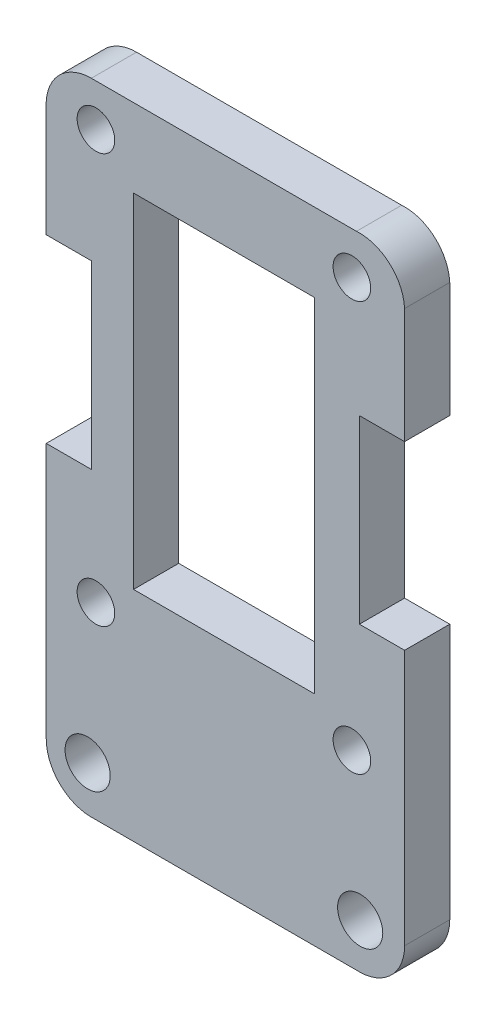
ISO-10303-21;
HEADER;
FILE_DESCRIPTION(('STEP AP214'),'2;1');
FILE_NAME('part.step','',(''),(''),'','','');
FILE_SCHEMA(('AUTOMOTIVE_DESIGN { 1 0 10303 214 1 1 1 1 }'));
ENDSEC;
DATA;
#1=APPLICATION_CONTEXT('core data for automotive mechanical design processes');
#2=APPLICATION_PROTOCOL_DEFINITION('international standard','automotive_design',2000,#1);
#3=PRODUCT_CONTEXT('',#1,'mechanical');
#4=PRODUCT('Part','Part','',(#3));
#5=PRODUCT_RELATED_PRODUCT_CATEGORY('part','',(#4));
#6=PRODUCT_DEFINITION_FORMATION('','',#4);
#7=PRODUCT_DEFINITION_CONTEXT('part definition',#1,'design');
#8=PRODUCT_DEFINITION('design','',#6,#7);
#9=PRODUCT_DEFINITION_SHAPE('','',#8);
#10=(LENGTH_UNIT() NAMED_UNIT(*) SI_UNIT(.MILLI.,.METRE.));
#11=(NAMED_UNIT(*) PLANE_ANGLE_UNIT() SI_UNIT($,.RADIAN.));
#12=(NAMED_UNIT(*) SI_UNIT($,.STERADIAN.) SOLID_ANGLE_UNIT());
#13=UNCERTAINTY_MEASURE_WITH_UNIT(LENGTH_MEASURE(1.E-05),#10,'distance_accuracy_value','');
#14=(GEOMETRIC_REPRESENTATION_CONTEXT(3) GLOBAL_UNCERTAINTY_ASSIGNED_CONTEXT((#13)) GLOBAL_UNIT_ASSIGNED_CONTEXT((#10,
#11,#12)) REPRESENTATION_CONTEXT('',''));
#15=CARTESIAN_POINT('',(0.,0.,0.));
#16=DIRECTION('',(0.,0.,1.));
#17=DIRECTION('',(1.,0.,0.));
#18=AXIS2_PLACEMENT_3D('',#15,#16,#17);
#19=CARTESIAN_POINT('',(203.997789668731,90.9845907724483,3.));
#20=DIRECTION('',(0.,0.,1.));
#21=DIRECTION('',(1.,0.,0.));
#22=AXIS2_PLACEMENT_3D('',#19,#20,#21);
#23=PLANE('',#22);
#24=CARTESIAN_POINT('',(203.74800641053,90.9850783751484,3.));
#25=DIRECTION('',(0.,0.,1.));
#26=DIRECTION('',(1.,0.,0.));
#27=AXIS2_PLACEMENT_3D('',#24,#25,#26);
#28=CIRCLE('',#27,1.50000000000003);
#29=CARTESIAN_POINT('',(205.24800641053,90.9850783751484,3.));
#30=VERTEX_POINT('',#29);
#31=EDGE_CURVE('E649',#30,#30,#28,.T.);
#32=ORIENTED_EDGE('',*,*,#31,.F.);
#33=EDGE_LOOP('',(#32));
#34=FACE_BOUND('',#33,.T.);
#35=CARTESIAN_POINT('',(221.29931162483,100.485839038348,3.));
#36=DIRECTION('',(0.,0.,1.));
#37=DIRECTION('',(1.,0.,0.));
#38=AXIS2_PLACEMENT_3D('',#35,#36,#37);
#39=CIRCLE('',#38,1.25000000000001);
#40=CARTESIAN_POINT('',(222.54931162483,100.485839038348,3.));
#41=VERTEX_POINT('',#40);
#42=EDGE_CURVE('E661',#41,#41,#39,.T.);
#43=ORIENTED_EDGE('',*,*,#42,.F.);
#44=EDGE_LOOP('',(#43));
#45=FACE_BOUND('',#44,.T.);
#46=CARTESIAN_POINT('',(204.297950444131,127.688016927548,3.));
#47=DIRECTION('',(0.,0.,1.));
#48=DIRECTION('',(1.,0.,0.));
#49=AXIS2_PLACEMENT_3D('',#46,#47,#48);
#50=CIRCLE('',#49,1.25000000000001);
#51=CARTESIAN_POINT('',(205.547950444131,127.688016927548,3.));
#52=VERTEX_POINT('',#51);
#53=EDGE_CURVE('E199',#52,#52,#50,.T.);
#54=ORIENTED_EDGE('',*,*,#53,.F.);
#55=EDGE_LOOP('',(#54));
#56=FACE_BOUND('',#55,.T.);
#57=CARTESIAN_POINT('',(203.997789668731,90.9845907724483,3.));
#58=DIRECTION('',(0.,0.,1.));
#59=DIRECTION('',(1.,0.,0.));
#60=AXIS2_PLACEMENT_3D('',#57,#58,#59);
#61=CIRCLE('',#60,3.00030966588245);
#62=CARTESIAN_POINT('',(200.997480003652,90.9845213157454,3.));
#63=VERTEX_POINT('',#62);
#64=CARTESIAN_POINT('',(203.897756421799,87.9859491732078,3.));
#65=VERTEX_POINT('',#64);
#66=EDGE_CURVE('E209',#63,#65,#61,.T.);
#67=ORIENTED_EDGE('',*,*,#66,.T.);
#68=DIRECTION('',(0.999999993647822,0.000112713597739843,0.));
#69=VECTOR('',#68,1.);
#70=CARTESIAN_POINT('',(203.897756421799,87.9859491732078,3.));
#71=LINE('',#70,#69);
#72=CARTESIAN_POINT('',(221.79936162483,87.9879669275483,3.));
#73=VERTEX_POINT('',#72);
#74=EDGE_CURVE('E212',#65,#73,#71,.T.);
#75=ORIENTED_EDGE('',*,*,#74,.T.);
#76=CARTESIAN_POINT('',(221.799121435695,90.9882071166832,3.));
#77=DIRECTION('',(0.,0.,1.));
#78=DIRECTION('',(1.,0.,0.));
#79=AXIS2_PLACEMENT_3D('',#76,#77,#78);
#80=CIRCLE('',#79,3.00024019874923);
#81=CARTESIAN_POINT('',(224.79936162483,90.9879669275484,3.));
#82=VERTEX_POINT('',#81);
#83=EDGE_CURVE('E215',#73,#82,#80,.T.);
#84=ORIENTED_EDGE('',*,*,#83,.T.);
#85=DIRECTION('',(2.35550647363132E-06,0.999999999997226,0.));
#86=VECTOR('',#85,1.);
#87=CARTESIAN_POINT('',(224.799401663531,107.985882496448,3.));
#88=LINE('',#87,#86);
#89=CARTESIAN_POINT('',(224.799401663531,107.985882496448,3.));
#90=VERTEX_POINT('',#89);
#91=EDGE_CURVE('E217',#82,#90,#88,.T.);
#92=ORIENTED_EDGE('',*,*,#91,.T.);
#93=DIRECTION('',(-1.,0.,0.));
#94=VECTOR('',#93,1.);
#95=CARTESIAN_POINT('',(224.799401663531,107.985882496448,3.));
#96=LINE('',#95,#94);
#97=CARTESIAN_POINT('',(221.799401663531,107.985882496448,3.));
#98=VERTEX_POINT('',#97);
#99=EDGE_CURVE('E219',#90,#98,#96,.T.);
#100=ORIENTED_EDGE('',*,*,#99,.T.);
#101=DIRECTION('',(0.,1.,0.));
#102=VECTOR('',#101,1.);
#103=CARTESIAN_POINT('',(221.799401663531,107.985882496448,3.));
#104=LINE('',#103,#102);
#105=CARTESIAN_POINT('',(221.799401663531,119.985882496448,3.));
#106=VERTEX_POINT('',#105);
#107=EDGE_CURVE('E221',#98,#106,#104,.T.);
#108=ORIENTED_EDGE('',*,*,#107,.T.);
#109=DIRECTION('',(1.,0.,0.));
#110=VECTOR('',#109,1.);
#111=CARTESIAN_POINT('',(221.799401663531,119.985882496448,3.));
#112=LINE('',#111,#110);
#113=CARTESIAN_POINT('',(224.799369027907,119.985882496448,3.));
#114=VERTEX_POINT('',#113);
#115=EDGE_CURVE('E223',#106,#114,#112,.T.);
#116=ORIENTED_EDGE('',*,*,#115,.T.);
#117=DIRECTION('',(4.26099005125352E-06,0.999999999990922,0.));
#118=VECTOR('',#117,1.);
#119=CARTESIAN_POINT('',(224.799369027907,119.985882496448,3.));
#120=LINE('',#119,#118);
#121=CARTESIAN_POINT('',(224.799401663601,127.645063488541,3.));
#122=VERTEX_POINT('',#121);
#123=EDGE_CURVE('E225',#114,#122,#120,.T.);
#124=ORIENTED_EDGE('',*,*,#123,.T.);
#125=CARTESIAN_POINT('',(221.803066522031,127.494223255448,3.));
#126=DIRECTION('',(0.,0.,1.));
#127=DIRECTION('',(1.,0.,0.));
#128=AXIS2_PLACEMENT_3D('',#125,#126,#127);
#129=CIRCLE('',#128,3.00012950662668);
#130=CARTESIAN_POINT('',(221.603142855191,130.487684059262,3.));
#131=VERTEX_POINT('',#130);
#132=EDGE_CURVE('E227',#122,#131,#129,.T.);
#133=ORIENTED_EDGE('',*,*,#132,.T.);
#134=DIRECTION('',(-1.,7.06118630227839E-13,0.));
#135=VECTOR('',#134,1.);
#136=CARTESIAN_POINT('',(203.993498606335,130.487684059274,3.));
#137=LINE('',#136,#135);
#138=CARTESIAN_POINT('',(203.993498606335,130.487684059274,3.));
#139=VERTEX_POINT('',#138);
#140=EDGE_CURVE('E229',#131,#139,#137,.T.);
#141=ORIENTED_EDGE('',*,*,#140,.T.);
#142=CARTESIAN_POINT('',(203.993498606366,127.48755455261,3.));
#143=DIRECTION('',(0.,0.,1.));
#144=DIRECTION('',(1.,0.,0.));
#145=AXIS2_PLACEMENT_3D('',#142,#143,#144);
#146=CIRCLE('',#145,3.00012950666453);
#147=CARTESIAN_POINT('',(200.997480003731,127.644556429748,3.));
#148=VERTEX_POINT('',#147);
#149=EDGE_CURVE('E231',#139,#148,#146,.T.);
#150=ORIENTED_EDGE('',*,*,#149,.T.);
#151=DIRECTION('',(0.,-1.,0.));
#152=VECTOR('',#151,1.);
#153=CARTESIAN_POINT('',(200.997480003731,127.644556429748,3.));
#154=LINE('',#153,#152);
#155=CARTESIAN_POINT('',(200.99748000373,119.985882496448,3.));
#156=VERTEX_POINT('',#155);
#157=EDGE_CURVE('E233',#148,#156,#154,.T.);
#158=ORIENTED_EDGE('',*,*,#157,.T.);
#159=DIRECTION('',(1.,0.,0.));
#160=VECTOR('',#159,1.);
#161=CARTESIAN_POINT('',(200.99748000373,119.985882496448,3.));
#162=LINE('',#161,#160);
#163=CARTESIAN_POINT('',(203.997720212031,119.985882496448,3.));
#164=VERTEX_POINT('',#163);
#165=EDGE_CURVE('E235',#156,#164,#162,.T.);
#166=ORIENTED_EDGE('',*,*,#165,.T.);
#167=DIRECTION('',(0.,-1.,0.));
#168=VECTOR('',#167,1.);
#169=CARTESIAN_POINT('',(203.997720212031,119.985882496448,3.));
#170=LINE('',#169,#168);
#171=CARTESIAN_POINT('',(203.997720212031,107.985882496448,3.));
#172=VERTEX_POINT('',#171);
#173=EDGE_CURVE('E237',#164,#172,#170,.T.);
#174=ORIENTED_EDGE('',*,*,#173,.T.);
#175=DIRECTION('',(-1.,0.,0.));
#176=VECTOR('',#175,1.);
#177=CARTESIAN_POINT('',(203.997720212031,107.985882496448,3.));
#178=LINE('',#177,#176);
#179=CARTESIAN_POINT('',(200.99748000373,107.985882496448,3.));
#180=VERTEX_POINT('',#179);
#181=EDGE_CURVE('E239',#172,#180,#178,.T.);
#182=ORIENTED_EDGE('',*,*,#181,.T.);
#183=DIRECTION('',(-4.61521941869236E-12,-1.,0.));
#184=VECTOR('',#183,1.);
#185=CARTESIAN_POINT('',(200.99748000373,107.985882496448,3.));
#186=LINE('',#185,#184);
#187=EDGE_CURVE('E241',#180,#63,#186,.T.);
#188=ORIENTED_EDGE('',*,*,#187,.T.);
#189=EDGE_LOOP('',(#67,#75,#84,#92,#100,#108,#116,#124,#133,#141,#150,#158,#166,#174,#182,#188));
#190=FACE_BOUND('',#189,.T.);
#191=DIRECTION('',(1.,0.,0.));
#192=VECTOR('',#191,1.);
#193=CARTESIAN_POINT('',(206.797840314031,102.485949173248,3.));
#194=LINE('',#193,#192);
#195=CARTESIAN_POINT('',(206.797840314031,102.485949173248,3.));
#196=VERTEX_POINT('',#195);
#197=CARTESIAN_POINT('',(218.798801147431,102.485949173248,3.));
#198=VERTEX_POINT('',#197);
#199=EDGE_CURVE('E178',#196,#198,#194,.T.);
#200=ORIENTED_EDGE('',*,*,#199,.F.);
#201=DIRECTION('',(0.,-1.,0.));
#202=VECTOR('',#201,1.);
#203=CARTESIAN_POINT('',(206.797840314031,125.285949173248,3.));
#204=LINE('',#203,#202);
#205=CARTESIAN_POINT('',(206.797840314031,125.285949173248,3.));
#206=VERTEX_POINT('',#205);
#207=EDGE_CURVE('E170',#206,#196,#204,.T.);
#208=ORIENTED_EDGE('',*,*,#207,.F.);
#209=DIRECTION('',(-1.,0.,0.));
#210=VECTOR('',#209,1.);
#211=CARTESIAN_POINT('',(218.798801147431,125.285949173248,3.));
#212=LINE('',#211,#210);
#213=CARTESIAN_POINT('',(218.798801147431,125.285949173248,3.));
#214=VERTEX_POINT('',#213);
#215=EDGE_CURVE('E193',#214,#206,#212,.T.);
#216=ORIENTED_EDGE('',*,*,#215,.F.);
#217=DIRECTION('',(0.,1.,0.));
#218=VECTOR('',#217,1.);
#219=CARTESIAN_POINT('',(218.798801147431,102.485949173248,3.));
#220=LINE('',#219,#218);
#221=EDGE_CURVE('E191',#198,#214,#220,.T.);
#222=ORIENTED_EDGE('',*,*,#221,.F.);
#223=EDGE_LOOP('',(#200,#208,#216,#222));
#224=FACE_BOUND('',#223,.T.);
#225=CARTESIAN_POINT('',(221.29931162483,127.688016927548,3.));
#226=DIRECTION('',(0.,0.,1.));
#227=DIRECTION('',(1.,0.,0.));
#228=AXIS2_PLACEMENT_3D('',#225,#226,#227);
#229=CIRCLE('',#228,1.25000000000001);
#230=CARTESIAN_POINT('',(222.54931162483,127.688016927548,3.));
#231=VERTEX_POINT('',#230);
#232=EDGE_CURVE('E667',#231,#231,#229,.T.);
#233=ORIENTED_EDGE('',*,*,#232,.F.);
#234=EDGE_LOOP('',(#233));
#235=FACE_BOUND('',#234,.T.);
#236=CARTESIAN_POINT('',(221.84945566773,90.9850783751484,3.));
#237=DIRECTION('',(0.,0.,1.));
#238=DIRECTION('',(1.,0.,0.));
#239=AXIS2_PLACEMENT_3D('',#236,#237,#238);
#240=CIRCLE('',#239,1.50000000000003);
#241=CARTESIAN_POINT('',(223.349455667731,90.9850783751484,3.));
#242=VERTEX_POINT('',#241);
#243=EDGE_CURVE('E655',#242,#242,#240,.T.);
#244=ORIENTED_EDGE('',*,*,#243,.F.);
#245=EDGE_LOOP('',(#244));
#246=FACE_BOUND('',#245,.T.);
#247=CARTESIAN_POINT('',(204.29795044413,100.485839038348,3.));
#248=DIRECTION('',(0.,0.,1.));
#249=DIRECTION('',(1.,0.,0.));
#250=AXIS2_PLACEMENT_3D('',#247,#248,#249);
#251=CIRCLE('',#250,1.25000000000004);
#252=CARTESIAN_POINT('',(205.547950444131,100.485839038348,3.));
#253=VERTEX_POINT('',#252);
#254=EDGE_CURVE('E640',#253,#253,#251,.T.);
#255=ORIENTED_EDGE('',*,*,#254,.F.);
#256=EDGE_LOOP('',(#255));
#257=FACE_BOUND('',#256,.T.);
#258=ADVANCED_FACE('F33',(#34,#45,#56,#190,#224,#235,#246,#257),#23,.T.);
#259=CARTESIAN_POINT('',(203.997789668731,90.9845907724483,0.));
#260=DIRECTION('',(0.,0.,1.));
#261=DIRECTION('',(1.,0.,0.));
#262=AXIS2_PLACEMENT_3D('',#259,#260,#261);
#263=PLANE('',#262);
#264=CARTESIAN_POINT('',(203.997789668731,90.9845907724483,0.));
#265=DIRECTION('',(0.,0.,1.));
#266=DIRECTION('',(1.,0.,0.));
#267=AXIS2_PLACEMENT_3D('',#264,#265,#266);
#268=CIRCLE('',#267,3.00030966588245);
#269=CARTESIAN_POINT('',(200.997480003652,90.9845213157454,0.));
#270=VERTEX_POINT('',#269);
#271=CARTESIAN_POINT('',(203.897756421799,87.9859491732078,0.));
#272=VERTEX_POINT('',#271);
#273=EDGE_CURVE('E186',#270,#272,#268,.T.);
#274=ORIENTED_EDGE('',*,*,#273,.F.);
#275=DIRECTION('',(-4.61521941869236E-12,-1.,0.));
#276=VECTOR('',#275,1.);
#277=CARTESIAN_POINT('',(200.99748000373,107.985882496448,0.));
#278=LINE('',#277,#276);
#279=CARTESIAN_POINT('',(200.99748000373,107.985882496448,0.));
#280=VERTEX_POINT('',#279);
#281=EDGE_CURVE('E213',#280,#270,#278,.T.);
#282=ORIENTED_EDGE('',*,*,#281,.F.);
#283=DIRECTION('',(-1.,0.,0.));
#284=VECTOR('',#283,1.);
#285=CARTESIAN_POINT('',(203.997720212031,107.985882496448,0.));
#286=LINE('',#285,#284);
#287=CARTESIAN_POINT('',(203.997720212031,107.985882496448,0.));
#288=VERTEX_POINT('',#287);
#289=EDGE_CURVE('E272',#288,#280,#286,.T.);
#290=ORIENTED_EDGE('',*,*,#289,.F.);
#291=DIRECTION('',(0.,-1.,0.));
#292=VECTOR('',#291,1.);
#293=CARTESIAN_POINT('',(203.997720212031,119.985882496448,0.));
#294=LINE('',#293,#292);
#295=CARTESIAN_POINT('',(203.997720212031,119.985882496448,0.));
#296=VERTEX_POINT('',#295);
#297=EDGE_CURVE('E270',#296,#288,#294,.T.);
#298=ORIENTED_EDGE('',*,*,#297,.F.);
#299=DIRECTION('',(1.,0.,0.));
#300=VECTOR('',#299,1.);
#301=CARTESIAN_POINT('',(200.99748000373,119.985882496448,0.));
#302=LINE('',#301,#300);
#303=CARTESIAN_POINT('',(200.99748000373,119.985882496448,0.));
#304=VERTEX_POINT('',#303);
#305=EDGE_CURVE('E268',#304,#296,#302,.T.);
#306=ORIENTED_EDGE('',*,*,#305,.F.);
#307=DIRECTION('',(0.,-1.,0.));
#308=VECTOR('',#307,1.);
#309=CARTESIAN_POINT('',(200.997480003731,127.644556429748,0.));
#310=LINE('',#309,#308);
#311=CARTESIAN_POINT('',(200.997480003731,127.644556429748,0.));
#312=VERTEX_POINT('',#311);
#313=EDGE_CURVE('E266',#312,#304,#310,.T.);
#314=ORIENTED_EDGE('',*,*,#313,.F.);
#315=CARTESIAN_POINT('',(203.993498606366,127.48755455261,0.));
#316=DIRECTION('',(0.,0.,1.));
#317=DIRECTION('',(1.,0.,0.));
#318=AXIS2_PLACEMENT_3D('',#315,#316,#317);
#319=CIRCLE('',#318,3.00012950666453);
#320=CARTESIAN_POINT('',(203.993498606335,130.487684059274,0.));
#321=VERTEX_POINT('',#320);
#322=EDGE_CURVE('E264',#321,#312,#319,.T.);
#323=ORIENTED_EDGE('',*,*,#322,.F.);
#324=DIRECTION('',(-1.,7.06118630227839E-13,0.));
#325=VECTOR('',#324,1.);
#326=CARTESIAN_POINT('',(203.993498606335,130.487684059274,0.));
#327=LINE('',#326,#325);
#328=CARTESIAN_POINT('',(221.603142855191,130.487684059262,0.));
#329=VERTEX_POINT('',#328);
#330=EDGE_CURVE('E262',#329,#321,#327,.T.);
#331=ORIENTED_EDGE('',*,*,#330,.F.);
#332=CARTESIAN_POINT('',(221.803066522031,127.494223255448,0.));
#333=DIRECTION('',(0.,0.,1.));
#334=DIRECTION('',(1.,0.,0.));
#335=AXIS2_PLACEMENT_3D('',#332,#333,#334);
#336=CIRCLE('',#335,3.00012950662668);
#337=CARTESIAN_POINT('',(224.799401663601,127.645063488541,0.));
#338=VERTEX_POINT('',#337);
#339=EDGE_CURVE('E260',#338,#329,#336,.T.);
#340=ORIENTED_EDGE('',*,*,#339,.F.);
#341=DIRECTION('',(4.26099005125352E-06,0.999999999990922,0.));
#342=VECTOR('',#341,1.);
#343=CARTESIAN_POINT('',(224.799369027907,119.985882496448,0.));
#344=LINE('',#343,#342);
#345=CARTESIAN_POINT('',(224.799369027907,119.985882496448,0.));
#346=VERTEX_POINT('',#345);
#347=EDGE_CURVE('E258',#346,#338,#344,.T.);
#348=ORIENTED_EDGE('',*,*,#347,.F.);
#349=DIRECTION('',(1.,0.,0.));
#350=VECTOR('',#349,1.);
#351=CARTESIAN_POINT('',(221.799401663531,119.985882496448,0.));
#352=LINE('',#351,#350);
#353=CARTESIAN_POINT('',(221.799401663531,119.985882496448,0.));
#354=VERTEX_POINT('',#353);
#355=EDGE_CURVE('E256',#354,#346,#352,.T.);
#356=ORIENTED_EDGE('',*,*,#355,.F.);
#357=DIRECTION('',(0.,1.,0.));
#358=VECTOR('',#357,1.);
#359=CARTESIAN_POINT('',(221.799401663531,107.985882496448,0.));
#360=LINE('',#359,#358);
#361=CARTESIAN_POINT('',(221.799401663531,107.985882496448,0.));
#362=VERTEX_POINT('',#361);
#363=EDGE_CURVE('E254',#362,#354,#360,.T.);
#364=ORIENTED_EDGE('',*,*,#363,.F.);
#365=DIRECTION('',(-1.,0.,0.));
#366=VECTOR('',#365,1.);
#367=CARTESIAN_POINT('',(224.799401663531,107.985882496448,0.));
#368=LINE('',#367,#366);
#369=CARTESIAN_POINT('',(224.799401663531,107.985882496448,0.));
#370=VERTEX_POINT('',#369);
#371=EDGE_CURVE('E252',#370,#362,#368,.T.);
#372=ORIENTED_EDGE('',*,*,#371,.F.);
#373=DIRECTION('',(2.35550647363132E-06,0.999999999997226,0.));
#374=VECTOR('',#373,1.);
#375=CARTESIAN_POINT('',(224.799401663531,107.985882496448,0.));
#376=LINE('',#375,#374);
#377=CARTESIAN_POINT('',(224.79936162483,90.9879669275484,0.));
#378=VERTEX_POINT('',#377);
#379=EDGE_CURVE('E250',#378,#370,#376,.T.);
#380=ORIENTED_EDGE('',*,*,#379,.F.);
#381=CARTESIAN_POINT('',(221.799121435695,90.9882071166832,0.));
#382=DIRECTION('',(0.,0.,1.));
#383=DIRECTION('',(1.,0.,0.));
#384=AXIS2_PLACEMENT_3D('',#381,#382,#383);
#385=CIRCLE('',#384,3.00024019874923);
#386=CARTESIAN_POINT('',(221.79936162483,87.9879669275483,0.));
#387=VERTEX_POINT('',#386);
#388=EDGE_CURVE('E248',#387,#378,#385,.T.);
#389=ORIENTED_EDGE('',*,*,#388,.F.);
#390=DIRECTION('',(0.999999993647822,0.000112713597739843,0.));
#391=VECTOR('',#390,1.);
#392=CARTESIAN_POINT('',(203.897756421799,87.9859491732078,0.));
#393=LINE('',#392,#391);
#394=EDGE_CURVE('E246',#272,#387,#393,.T.);
#395=ORIENTED_EDGE('',*,*,#394,.F.);
#396=EDGE_LOOP('',(#274,#282,#290,#298,#306,#314,#323,#331,#340,#348,#356,#364,#372,#380,#389,#395));
#397=FACE_BOUND('',#396,.T.);
#398=DIRECTION('',(0.,-1.,0.));
#399=VECTOR('',#398,1.);
#400=CARTESIAN_POINT('',(206.797840314031,125.285949173248,0.));
#401=LINE('',#400,#399);
#402=CARTESIAN_POINT('',(206.797840314031,125.285949173248,0.));
#403=VERTEX_POINT('',#402);
#404=CARTESIAN_POINT('',(206.797840314031,102.485949173248,0.));
#405=VERTEX_POINT('',#404);
#406=EDGE_CURVE('E56',#403,#405,#401,.T.);
#407=ORIENTED_EDGE('',*,*,#406,.T.);
#408=DIRECTION('',(1.,0.,0.));
#409=VECTOR('',#408,1.);
#410=CARTESIAN_POINT('',(206.797840314031,102.485949173248,0.));
#411=LINE('',#410,#409);
#412=CARTESIAN_POINT('',(218.798801147431,102.485949173248,0.));
#413=VERTEX_POINT('',#412);
#414=EDGE_CURVE('E185',#405,#413,#411,.T.);
#415=ORIENTED_EDGE('',*,*,#414,.T.);
#416=DIRECTION('',(0.,1.,0.));
#417=VECTOR('',#416,1.);
#418=CARTESIAN_POINT('',(218.798801147431,102.485949173248,0.));
#419=LINE('',#418,#417);
#420=CARTESIAN_POINT('',(218.798801147431,125.285949173248,0.));
#421=VERTEX_POINT('',#420);
#422=EDGE_CURVE('E201',#413,#421,#419,.T.);
#423=ORIENTED_EDGE('',*,*,#422,.T.);
#424=DIRECTION('',(-1.,0.,0.));
#425=VECTOR('',#424,1.);
#426=CARTESIAN_POINT('',(218.798801147431,125.285949173248,0.));
#427=LINE('',#426,#425);
#428=EDGE_CURVE('E179',#421,#403,#427,.T.);
#429=ORIENTED_EDGE('',*,*,#428,.T.);
#430=EDGE_LOOP('',(#407,#415,#423,#429));
#431=FACE_BOUND('',#430,.T.);
#432=CARTESIAN_POINT('',(204.297950444131,127.688016927548,0.));
#433=DIRECTION('',(0.,0.,1.));
#434=DIRECTION('',(1.,0.,0.));
#435=AXIS2_PLACEMENT_3D('',#432,#433,#434);
#436=CIRCLE('',#435,1.25000000000001);
#437=CARTESIAN_POINT('',(205.547950444131,127.688016927548,0.));
#438=VERTEX_POINT('',#437);
#439=EDGE_CURVE('E670',#438,#438,#436,.T.);
#440=ORIENTED_EDGE('',*,*,#439,.T.);
#441=EDGE_LOOP('',(#440));
#442=FACE_BOUND('',#441,.T.);
#443=CARTESIAN_POINT('',(221.29931162483,127.688016927548,0.));
#444=DIRECTION('',(0.,0.,1.));
#445=DIRECTION('',(1.,0.,0.));
#446=AXIS2_PLACEMENT_3D('',#443,#444,#445);
#447=CIRCLE('',#446,1.25000000000001);
#448=CARTESIAN_POINT('',(222.54931162483,127.688016927548,0.));
#449=VERTEX_POINT('',#448);
#450=EDGE_CURVE('E664',#449,#449,#447,.T.);
#451=ORIENTED_EDGE('',*,*,#450,.T.);
#452=EDGE_LOOP('',(#451));
#453=FACE_BOUND('',#452,.T.);
#454=CARTESIAN_POINT('',(221.29931162483,100.485839038348,0.));
#455=DIRECTION('',(0.,0.,1.));
#456=DIRECTION('',(1.,0.,0.));
#457=AXIS2_PLACEMENT_3D('',#454,#455,#456);
#458=CIRCLE('',#457,1.25000000000001);
#459=CARTESIAN_POINT('',(222.54931162483,100.485839038348,0.));
#460=VERTEX_POINT('',#459);
#461=EDGE_CURVE('E658',#460,#460,#458,.T.);
#462=ORIENTED_EDGE('',*,*,#461,.T.);
#463=EDGE_LOOP('',(#462));
#464=FACE_BOUND('',#463,.T.);
#465=CARTESIAN_POINT('',(221.84945566773,90.9850783751484,0.));
#466=DIRECTION('',(0.,0.,1.));
#467=DIRECTION('',(1.,0.,0.));
#468=AXIS2_PLACEMENT_3D('',#465,#466,#467);
#469=CIRCLE('',#468,1.50000000000003);
#470=CARTESIAN_POINT('',(223.349455667731,90.9850783751484,0.));
#471=VERTEX_POINT('',#470);
#472=EDGE_CURVE('E652',#471,#471,#469,.T.);
#473=ORIENTED_EDGE('',*,*,#472,.T.);
#474=EDGE_LOOP('',(#473));
#475=FACE_BOUND('',#474,.T.);
#476=CARTESIAN_POINT('',(203.74800641053,90.9850783751484,0.));
#477=DIRECTION('',(0.,0.,1.));
#478=DIRECTION('',(1.,0.,0.));
#479=AXIS2_PLACEMENT_3D('',#476,#477,#478);
#480=CIRCLE('',#479,1.50000000000003);
#481=CARTESIAN_POINT('',(205.24800641053,90.9850783751484,0.));
#482=VERTEX_POINT('',#481);
#483=EDGE_CURVE('E646',#482,#482,#480,.T.);
#484=ORIENTED_EDGE('',*,*,#483,.T.);
#485=EDGE_LOOP('',(#484));
#486=FACE_BOUND('',#485,.T.);
#487=CARTESIAN_POINT('',(204.29795044413,100.485839038348,0.));
#488=DIRECTION('',(0.,0.,1.));
#489=DIRECTION('',(1.,0.,0.));
#490=AXIS2_PLACEMENT_3D('',#487,#488,#489);
#491=CIRCLE('',#490,1.25000000000004);
#492=CARTESIAN_POINT('',(205.547950444131,100.485839038348,0.));
#493=VERTEX_POINT('',#492);
#494=EDGE_CURVE('E643',#493,#493,#491,.T.);
#495=ORIENTED_EDGE('',*,*,#494,.T.);
#496=EDGE_LOOP('',(#495));
#497=FACE_BOUND('',#496,.T.);
#498=ADVANCED_FACE('F326',(#397,#431,#442,#453,#464,#475,#486,#497),#263,.F.);
#499=CARTESIAN_POINT('',(203.997789668731,90.9845907724483,3.));
#500=DIRECTION('',(0.,0.,-1.));
#501=DIRECTION('',(-1.,0.,0.));
#502=AXIS2_PLACEMENT_3D('',#499,#500,#501);
#503=CYLINDRICAL_SURFACE('',#502,3.00030966588245);
#504=ORIENTED_EDGE('',*,*,#273,.T.);
#505=DIRECTION('',(0.,0.,-1.));
#506=VECTOR('',#505,1.);
#507=CARTESIAN_POINT('',(203.897756421799,87.9859491732078,3.));
#508=LINE('',#507,#506);
#509=EDGE_CURVE('E11',#65,#272,#508,.T.);
#510=ORIENTED_EDGE('',*,*,#509,.F.);
#511=ORIENTED_EDGE('',*,*,#66,.F.);
#512=DIRECTION('',(0.,0.,-1.));
#513=VECTOR('',#512,1.);
#514=CARTESIAN_POINT('',(200.997480003652,90.9845213157454,3.));
#515=LINE('',#514,#513);
#516=EDGE_CURVE('E243',#63,#270,#515,.T.);
#517=ORIENTED_EDGE('',*,*,#516,.T.);
#518=EDGE_LOOP('',(#504,#510,#511,#517));
#519=FACE_BOUND('',#518,.T.);
#520=ADVANCED_FACE('F35',(#519),#503,.T.);
#521=CARTESIAN_POINT('',(203.897756421799,87.9859491732078,3.));
#522=DIRECTION('',(-0.000112713597739843,0.999999993647823,0.));
#523=DIRECTION('',(-0.999999993647823,-0.000112713597739843,0.));
#524=AXIS2_PLACEMENT_3D('',#521,#522,#523);
#525=PLANE('',#524);
#526=ORIENTED_EDGE('',*,*,#394,.T.);
#527=DIRECTION('',(0.,0.,-1.));
#528=VECTOR('',#527,1.);
#529=CARTESIAN_POINT('',(221.79936162483,87.9879669275483,3.));
#530=LINE('',#529,#528);
#531=EDGE_CURVE('E41',#73,#387,#530,.T.);
#532=ORIENTED_EDGE('',*,*,#531,.F.);
#533=ORIENTED_EDGE('',*,*,#74,.F.);
#534=ORIENTED_EDGE('',*,*,#509,.T.);
#535=EDGE_LOOP('',(#526,#532,#533,#534));
#536=FACE_BOUND('',#535,.T.);
#537=ADVANCED_FACE('F343',(#536),#525,.F.);
#538=CARTESIAN_POINT('',(221.799121435695,90.9882071166832,3.));
#539=DIRECTION('',(0.,0.,-1.));
#540=DIRECTION('',(-1.,0.,0.));
#541=AXIS2_PLACEMENT_3D('',#538,#539,#540);
#542=CYLINDRICAL_SURFACE('',#541,3.00024019874923);
#543=ORIENTED_EDGE('',*,*,#388,.T.);
#544=DIRECTION('',(0.,0.,-1.));
#545=VECTOR('',#544,1.);
#546=CARTESIAN_POINT('',(224.79936162483,90.9879669275484,3.));
#547=LINE('',#546,#545);
#548=EDGE_CURVE('E313',#82,#378,#547,.T.);
#549=ORIENTED_EDGE('',*,*,#548,.F.);
#550=ORIENTED_EDGE('',*,*,#83,.F.);
#551=ORIENTED_EDGE('',*,*,#531,.T.);
#552=EDGE_LOOP('',(#543,#549,#550,#551));
#553=FACE_BOUND('',#552,.T.);
#554=ADVANCED_FACE('F320',(#553),#542,.T.);
#555=CARTESIAN_POINT('',(224.799401663531,107.985882496448,3.));
#556=DIRECTION('',(-0.999999999997226,2.35550647363132E-06,0.));
#557=DIRECTION('',(-2.35550647363132E-06,-0.999999999997226,0.));
#558=AXIS2_PLACEMENT_3D('',#555,#556,#557);
#559=PLANE('',#558);
#560=ORIENTED_EDGE('',*,*,#379,.T.);
#561=DIRECTION('',(0.,0.,-1.));
#562=VECTOR('',#561,1.);
#563=CARTESIAN_POINT('',(224.799401663531,107.985882496448,3.));
#564=LINE('',#563,#562);
#565=EDGE_CURVE('E310',#90,#370,#564,.T.);
#566=ORIENTED_EDGE('',*,*,#565,.F.);
#567=ORIENTED_EDGE('',*,*,#91,.F.);
#568=ORIENTED_EDGE('',*,*,#548,.T.);
#569=EDGE_LOOP('',(#560,#566,#567,#568));
#570=FACE_BOUND('',#569,.T.);
#571=ADVANCED_FACE('F332',(#570),#559,.F.);
#572=CARTESIAN_POINT('',(224.799401663531,107.985882496448,3.));
#573=DIRECTION('',(0.,-1.,0.));
#574=DIRECTION('',(0.,0.,-1.));
#575=AXIS2_PLACEMENT_3D('',#572,#573,#574);
#576=PLANE('',#575);
#577=ORIENTED_EDGE('',*,*,#371,.T.);
#578=DIRECTION('',(0.,0.,-1.));
#579=VECTOR('',#578,1.);
#580=CARTESIAN_POINT('',(221.799401663531,107.985882496448,3.));
#581=LINE('',#580,#579);
#582=EDGE_CURVE('E307',#98,#362,#581,.T.);
#583=ORIENTED_EDGE('',*,*,#582,.F.);
#584=ORIENTED_EDGE('',*,*,#99,.F.);
#585=ORIENTED_EDGE('',*,*,#565,.T.);
#586=EDGE_LOOP('',(#577,#583,#584,#585));
#587=FACE_BOUND('',#586,.T.);
#588=ADVANCED_FACE('F336',(#587),#576,.F.);
#589=CARTESIAN_POINT('',(221.799401663531,107.985882496448,3.));
#590=DIRECTION('',(-1.,0.,0.));
#591=DIRECTION('',(0.,0.,1.));
#592=AXIS2_PLACEMENT_3D('',#589,#590,#591);
#593=PLANE('',#592);
#594=ORIENTED_EDGE('',*,*,#363,.T.);
#595=DIRECTION('',(0.,0.,-1.));
#596=VECTOR('',#595,1.);
#597=CARTESIAN_POINT('',(221.799401663531,119.985882496448,3.));
#598=LINE('',#597,#596);
#599=EDGE_CURVE('E304',#106,#354,#598,.T.);
#600=ORIENTED_EDGE('',*,*,#599,.F.);
#601=ORIENTED_EDGE('',*,*,#107,.F.);
#602=ORIENTED_EDGE('',*,*,#582,.T.);
#603=EDGE_LOOP('',(#594,#600,#601,#602));
#604=FACE_BOUND('',#603,.T.);
#605=ADVANCED_FACE('F396',(#604),#593,.F.);
#606=CARTESIAN_POINT('',(221.799401663531,119.985882496448,3.));
#607=DIRECTION('',(0.,1.,0.));
#608=DIRECTION('',(0.,0.,1.));
#609=AXIS2_PLACEMENT_3D('',#606,#607,#608);
#610=PLANE('',#609);
#611=ORIENTED_EDGE('',*,*,#355,.T.);
#612=DIRECTION('',(0.,0.,-1.));
#613=VECTOR('',#612,1.);
#614=CARTESIAN_POINT('',(224.799369027907,119.985882496448,3.));
#615=LINE('',#614,#613);
#616=EDGE_CURVE('E301',#114,#346,#615,.T.);
#617=ORIENTED_EDGE('',*,*,#616,.F.);
#618=ORIENTED_EDGE('',*,*,#115,.F.);
#619=ORIENTED_EDGE('',*,*,#599,.T.);
#620=EDGE_LOOP('',(#611,#617,#618,#619));
#621=FACE_BOUND('',#620,.T.);
#622=ADVANCED_FACE('F393',(#621),#610,.F.);
#623=CARTESIAN_POINT('',(224.799369027907,119.985882496448,3.));
#624=DIRECTION('',(-0.999999999990922,4.26099005125352E-06,0.));
#625=DIRECTION('',(-4.26099005125352E-06,-0.999999999990922,0.));
#626=AXIS2_PLACEMENT_3D('',#623,#624,#625);
#627=PLANE('',#626);
#628=ORIENTED_EDGE('',*,*,#347,.T.);
#629=DIRECTION('',(0.,0.,-1.));
#630=VECTOR('',#629,1.);
#631=CARTESIAN_POINT('',(224.799401663601,127.645063488541,3.));
#632=LINE('',#631,#630);
#633=EDGE_CURVE('E298',#122,#338,#632,.T.);
#634=ORIENTED_EDGE('',*,*,#633,.F.);
#635=ORIENTED_EDGE('',*,*,#123,.F.);
#636=ORIENTED_EDGE('',*,*,#616,.T.);
#637=EDGE_LOOP('',(#628,#634,#635,#636));
#638=FACE_BOUND('',#637,.T.);
#639=ADVANCED_FACE('F389',(#638),#627,.F.);
#640=CARTESIAN_POINT('',(221.803066522031,127.494223255448,3.));
#641=DIRECTION('',(0.,0.,-1.));
#642=DIRECTION('',(-1.,0.,0.));
#643=AXIS2_PLACEMENT_3D('',#640,#641,#642);
#644=CYLINDRICAL_SURFACE('',#643,3.00012950662668);
#645=ORIENTED_EDGE('',*,*,#339,.T.);
#646=DIRECTION('',(0.,0.,-1.));
#647=VECTOR('',#646,1.);
#648=CARTESIAN_POINT('',(221.603142855191,130.487684059262,3.));
#649=LINE('',#648,#647);
#650=EDGE_CURVE('E295',#131,#329,#649,.T.);
#651=ORIENTED_EDGE('',*,*,#650,.F.);
#652=ORIENTED_EDGE('',*,*,#132,.F.);
#653=ORIENTED_EDGE('',*,*,#633,.T.);
#654=EDGE_LOOP('',(#645,#651,#652,#653));
#655=FACE_BOUND('',#654,.T.);
#656=ADVANCED_FACE('F385',(#655),#644,.T.);
#657=CARTESIAN_POINT('',(203.993498606335,130.487684059274,3.));
#658=DIRECTION('',(-7.06118630227839E-13,-1.,0.));
#659=DIRECTION('',(1.,-7.06118630227839E-13,0.));
#660=AXIS2_PLACEMENT_3D('',#657,#658,#659);
#661=PLANE('',#660);
#662=ORIENTED_EDGE('',*,*,#330,.T.);
#663=DIRECTION('',(0.,0.,-1.));
#664=VECTOR('',#663,1.);
#665=CARTESIAN_POINT('',(203.993498606335,130.487684059274,3.));
#666=LINE('',#665,#664);
#667=EDGE_CURVE('E292',#139,#321,#666,.T.);
#668=ORIENTED_EDGE('',*,*,#667,.F.);
#669=ORIENTED_EDGE('',*,*,#140,.F.);
#670=ORIENTED_EDGE('',*,*,#650,.T.);
#671=EDGE_LOOP('',(#662,#668,#669,#670));
#672=FACE_BOUND('',#671,.T.);
#673=ADVANCED_FACE('F380',(#672),#661,.F.);
#674=CARTESIAN_POINT('',(203.993498606366,127.48755455261,3.));
#675=DIRECTION('',(0.,0.,-1.));
#676=DIRECTION('',(-1.,0.,0.));
#677=AXIS2_PLACEMENT_3D('',#674,#675,#676);
#678=CYLINDRICAL_SURFACE('',#677,3.00012950666453);
#679=ORIENTED_EDGE('',*,*,#322,.T.);
#680=DIRECTION('',(0.,0.,-1.));
#681=VECTOR('',#680,1.);
#682=CARTESIAN_POINT('',(200.997480003731,127.644556429748,3.));
#683=LINE('',#682,#681);
#684=EDGE_CURVE('E289',#148,#312,#683,.T.);
#685=ORIENTED_EDGE('',*,*,#684,.F.);
#686=ORIENTED_EDGE('',*,*,#149,.F.);
#687=ORIENTED_EDGE('',*,*,#667,.T.);
#688=EDGE_LOOP('',(#679,#685,#686,#687));
#689=FACE_BOUND('',#688,.T.);
#690=ADVANCED_FACE('F374',(#689),#678,.T.);
#691=CARTESIAN_POINT('',(200.997480003731,127.644556429748,3.));
#692=DIRECTION('',(1.,0.,0.));
#693=DIRECTION('',(0.,1.,0.));
#694=AXIS2_PLACEMENT_3D('',#691,#692,#693);
#695=PLANE('',#694);
#696=ORIENTED_EDGE('',*,*,#313,.T.);
#697=DIRECTION('',(0.,0.,-1.));
#698=VECTOR('',#697,1.);
#699=CARTESIAN_POINT('',(200.99748000373,119.985882496448,3.));
#700=LINE('',#699,#698);
#701=EDGE_CURVE('E286',#156,#304,#700,.T.);
#702=ORIENTED_EDGE('',*,*,#701,.F.);
#703=ORIENTED_EDGE('',*,*,#157,.F.);
#704=ORIENTED_EDGE('',*,*,#684,.T.);
#705=EDGE_LOOP('',(#696,#702,#703,#704));
#706=FACE_BOUND('',#705,.T.);
#707=ADVANCED_FACE('F370',(#706),#695,.F.);
#708=CARTESIAN_POINT('',(200.99748000373,119.985882496448,3.));
#709=DIRECTION('',(0.,1.,0.));
#710=DIRECTION('',(0.,0.,1.));
#711=AXIS2_PLACEMENT_3D('',#708,#709,#710);
#712=PLANE('',#711);
#713=ORIENTED_EDGE('',*,*,#305,.T.);
#714=DIRECTION('',(0.,0.,-1.));
#715=VECTOR('',#714,1.);
#716=CARTESIAN_POINT('',(203.997720212031,119.985882496448,3.));
#717=LINE('',#716,#715);
#718=EDGE_CURVE('E283',#164,#296,#717,.T.);
#719=ORIENTED_EDGE('',*,*,#718,.F.);
#720=ORIENTED_EDGE('',*,*,#165,.F.);
#721=ORIENTED_EDGE('',*,*,#701,.T.);
#722=EDGE_LOOP('',(#713,#719,#720,#721));
#723=FACE_BOUND('',#722,.T.);
#724=ADVANCED_FACE('F365',(#723),#712,.F.);
#725=CARTESIAN_POINT('',(203.997720212031,119.985882496448,3.));
#726=DIRECTION('',(1.,0.,0.));
#727=DIRECTION('',(0.,0.,-1.));
#728=AXIS2_PLACEMENT_3D('',#725,#726,#727);
#729=PLANE('',#728);
#730=ORIENTED_EDGE('',*,*,#297,.T.);
#731=DIRECTION('',(0.,0.,-1.));
#732=VECTOR('',#731,1.);
#733=CARTESIAN_POINT('',(203.997720212031,107.985882496448,3.));
#734=LINE('',#733,#732);
#735=EDGE_CURVE('E280',#172,#288,#734,.T.);
#736=ORIENTED_EDGE('',*,*,#735,.F.);
#737=ORIENTED_EDGE('',*,*,#173,.F.);
#738=ORIENTED_EDGE('',*,*,#718,.T.);
#739=EDGE_LOOP('',(#730,#736,#737,#738));
#740=FACE_BOUND('',#739,.T.);
#741=ADVANCED_FACE('F359',(#740),#729,.F.);
#742=CARTESIAN_POINT('',(203.997720212031,107.985882496448,3.));
#743=DIRECTION('',(0.,-1.,0.));
#744=DIRECTION('',(0.,0.,-1.));
#745=AXIS2_PLACEMENT_3D('',#742,#743,#744);
#746=PLANE('',#745);
#747=ORIENTED_EDGE('',*,*,#289,.T.);
#748=DIRECTION('',(0.,0.,-1.));
#749=VECTOR('',#748,1.);
#750=CARTESIAN_POINT('',(200.99748000373,107.985882496448,3.));
#751=LINE('',#750,#749);
#752=EDGE_CURVE('E277',#180,#280,#751,.T.);
#753=ORIENTED_EDGE('',*,*,#752,.F.);
#754=ORIENTED_EDGE('',*,*,#181,.F.);
#755=ORIENTED_EDGE('',*,*,#735,.T.);
#756=EDGE_LOOP('',(#747,#753,#754,#755));
#757=FACE_BOUND('',#756,.T.);
#758=ADVANCED_FACE('F355',(#757),#746,.F.);
#759=CARTESIAN_POINT('',(200.99748000373,107.985882496448,3.));
#760=DIRECTION('',(1.,-4.61521941869236E-12,0.));
#761=DIRECTION('',(4.61521941869236E-12,1.,0.));
#762=AXIS2_PLACEMENT_3D('',#759,#760,#761);
#763=PLANE('',#762);
#764=ORIENTED_EDGE('',*,*,#281,.T.);
#765=ORIENTED_EDGE('',*,*,#516,.F.);
#766=ORIENTED_EDGE('',*,*,#187,.F.);
#767=ORIENTED_EDGE('',*,*,#752,.T.);
#768=EDGE_LOOP('',(#764,#765,#766,#767));
#769=FACE_BOUND('',#768,.T.);
#770=ADVANCED_FACE('F350',(#769),#763,.F.);
#771=CARTESIAN_POINT('',(206.797840314031,125.285949173248,3.));
#772=DIRECTION('',(1.,0.,0.));
#773=DIRECTION('',(0.,0.,-1.));
#774=AXIS2_PLACEMENT_3D('',#771,#772,#773);
#775=PLANE('',#774);
#776=ORIENTED_EDGE('',*,*,#406,.F.);
#777=DIRECTION('',(0.,0.,-1.));
#778=VECTOR('',#777,1.);
#779=CARTESIAN_POINT('',(206.797840314031,125.285949173248,3.));
#780=LINE('',#779,#778);
#781=EDGE_CURVE('E174',#206,#403,#780,.T.);
#782=ORIENTED_EDGE('',*,*,#781,.F.);
#783=ORIENTED_EDGE('',*,*,#207,.T.);
#784=DIRECTION('',(0.,0.,-1.));
#785=VECTOR('',#784,1.);
#786=CARTESIAN_POINT('',(206.797840314031,102.485949173248,3.));
#787=LINE('',#786,#785);
#788=EDGE_CURVE('E173',#196,#405,#787,.T.);
#789=ORIENTED_EDGE('',*,*,#788,.T.);
#790=EDGE_LOOP('',(#776,#782,#783,#789));
#791=FACE_BOUND('',#790,.T.);
#792=ADVANCED_FACE('F172',(#791),#775,.T.);
#793=CARTESIAN_POINT('',(206.797840314031,102.485949173248,3.));
#794=DIRECTION('',(0.,1.,0.));
#795=DIRECTION('',(0.,0.,1.));
#796=AXIS2_PLACEMENT_3D('',#793,#794,#795);
#797=PLANE('',#796);
#798=ORIENTED_EDGE('',*,*,#414,.F.);
#799=ORIENTED_EDGE('',*,*,#788,.F.);
#800=ORIENTED_EDGE('',*,*,#199,.T.);
#801=DIRECTION('',(0.,0.,-1.));
#802=VECTOR('',#801,1.);
#803=CARTESIAN_POINT('',(218.798801147431,102.485949173248,3.));
#804=LINE('',#803,#802);
#805=EDGE_CURVE('E187',#198,#413,#804,.T.);
#806=ORIENTED_EDGE('',*,*,#805,.T.);
#807=EDGE_LOOP('',(#798,#799,#800,#806));
#808=FACE_BOUND('',#807,.T.);
#809=ADVANCED_FACE('F182',(#808),#797,.T.);
#810=CARTESIAN_POINT('',(218.798801147431,102.485949173248,3.));
#811=DIRECTION('',(-1.,0.,0.));
#812=DIRECTION('',(0.,0.,1.));
#813=AXIS2_PLACEMENT_3D('',#810,#811,#812);
#814=PLANE('',#813);
#815=ORIENTED_EDGE('',*,*,#422,.F.);
#816=ORIENTED_EDGE('',*,*,#805,.F.);
#817=ORIENTED_EDGE('',*,*,#221,.T.);
#818=DIRECTION('',(0.,0.,-1.));
#819=VECTOR('',#818,1.);
#820=CARTESIAN_POINT('',(218.798801147431,125.285949173248,3.));
#821=LINE('',#820,#819);
#822=EDGE_CURVE('E48',#214,#421,#821,.T.);
#823=ORIENTED_EDGE('',*,*,#822,.T.);
#824=EDGE_LOOP('',(#815,#816,#817,#823));
#825=FACE_BOUND('',#824,.T.);
#826=ADVANCED_FACE('F481',(#825),#814,.T.);
#827=CARTESIAN_POINT('',(218.798801147431,125.285949173248,3.));
#828=DIRECTION('',(0.,-1.,0.));
#829=DIRECTION('',(0.,0.,-1.));
#830=AXIS2_PLACEMENT_3D('',#827,#828,#829);
#831=PLANE('',#830);
#832=ORIENTED_EDGE('',*,*,#428,.F.);
#833=ORIENTED_EDGE('',*,*,#822,.F.);
#834=ORIENTED_EDGE('',*,*,#215,.T.);
#835=ORIENTED_EDGE('',*,*,#781,.T.);
#836=EDGE_LOOP('',(#832,#833,#834,#835));
#837=FACE_BOUND('',#836,.T.);
#838=ADVANCED_FACE('F487',(#837),#831,.T.);
#839=CARTESIAN_POINT('',(204.297950444131,127.688016927548,3.));
#840=DIRECTION('',(0.,0.,-1.));
#841=DIRECTION('',(-1.,0.,0.));
#842=AXIS2_PLACEMENT_3D('',#839,#840,#841);
#843=CYLINDRICAL_SURFACE('',#842,1.25000000000001);
#844=ORIENTED_EDGE('',*,*,#53,.T.);
#845=EDGE_LOOP('',(#844));
#846=FACE_BOUND('',#845,.T.);
#847=ORIENTED_EDGE('',*,*,#439,.F.);
#848=EDGE_LOOP('',(#847));
#849=FACE_BOUND('',#848,.T.);
#850=ADVANCED_FACE('F495',(#846,#849),#843,.F.);
#851=CARTESIAN_POINT('',(221.29931162483,127.688016927548,3.));
#852=DIRECTION('',(0.,0.,-1.));
#853=DIRECTION('',(-1.,0.,0.));
#854=AXIS2_PLACEMENT_3D('',#851,#852,#853);
#855=CYLINDRICAL_SURFACE('',#854,1.25000000000001);
#856=ORIENTED_EDGE('',*,*,#232,.T.);
#857=EDGE_LOOP('',(#856));
#858=FACE_BOUND('',#857,.T.);
#859=ORIENTED_EDGE('',*,*,#450,.F.);
#860=EDGE_LOOP('',(#859));
#861=FACE_BOUND('',#860,.T.);
#862=ADVANCED_FACE('F502',(#858,#861),#855,.F.);
#863=CARTESIAN_POINT('',(221.29931162483,100.485839038348,3.));
#864=DIRECTION('',(0.,0.,-1.));
#865=DIRECTION('',(-1.,0.,0.));
#866=AXIS2_PLACEMENT_3D('',#863,#864,#865);
#867=CYLINDRICAL_SURFACE('',#866,1.25000000000001);
#868=ORIENTED_EDGE('',*,*,#42,.T.);
#869=EDGE_LOOP('',(#868));
#870=FACE_BOUND('',#869,.T.);
#871=ORIENTED_EDGE('',*,*,#461,.F.);
#872=EDGE_LOOP('',(#871));
#873=FACE_BOUND('',#872,.T.);
#874=ADVANCED_FACE('F510',(#870,#873),#867,.F.);
#875=CARTESIAN_POINT('',(221.84945566773,90.9850783751484,3.));
#876=DIRECTION('',(0.,0.,-1.));
#877=DIRECTION('',(-1.,0.,0.));
#878=AXIS2_PLACEMENT_3D('',#875,#876,#877);
#879=CYLINDRICAL_SURFACE('',#878,1.50000000000003);
#880=ORIENTED_EDGE('',*,*,#243,.T.);
#881=EDGE_LOOP('',(#880));
#882=FACE_BOUND('',#881,.T.);
#883=ORIENTED_EDGE('',*,*,#472,.F.);
#884=EDGE_LOOP('',(#883));
#885=FACE_BOUND('',#884,.T.);
#886=ADVANCED_FACE('F518',(#882,#885),#879,.F.);
#887=CARTESIAN_POINT('',(203.74800641053,90.9850783751484,3.));
#888=DIRECTION('',(0.,0.,-1.));
#889=DIRECTION('',(-1.,0.,0.));
#890=AXIS2_PLACEMENT_3D('',#887,#888,#889);
#891=CYLINDRICAL_SURFACE('',#890,1.50000000000003);
#892=ORIENTED_EDGE('',*,*,#31,.T.);
#893=EDGE_LOOP('',(#892));
#894=FACE_BOUND('',#893,.T.);
#895=ORIENTED_EDGE('',*,*,#483,.F.);
#896=EDGE_LOOP('',(#895));
#897=FACE_BOUND('',#896,.T.);
#898=ADVANCED_FACE('F526',(#894,#897),#891,.F.);
#899=CARTESIAN_POINT('',(204.29795044413,100.485839038348,3.));
#900=DIRECTION('',(0.,0.,-1.));
#901=DIRECTION('',(-1.,0.,0.));
#902=AXIS2_PLACEMENT_3D('',#899,#900,#901);
#903=CYLINDRICAL_SURFACE('',#902,1.25000000000004);
#904=ORIENTED_EDGE('',*,*,#254,.T.);
#905=EDGE_LOOP('',(#904));
#906=FACE_BOUND('',#905,.T.);
#907=ORIENTED_EDGE('',*,*,#494,.F.);
#908=EDGE_LOOP('',(#907));
#909=FACE_BOUND('',#908,.T.);
#910=ADVANCED_FACE('F534',(#906,#909),#903,.F.);
#911=CLOSED_SHELL('',(#258,#498,#520,#537,#554,#571,#588,#605,#622,#639,#656,#673,#690,#707,
#724,#741,#758,#770,#792,#809,#826,#838,#850,#862,#874,#886,#898,#910));
#912=MANIFOLD_SOLID_BREP('B2',#911);
#913=ADVANCED_BREP_SHAPE_REPRESENTATION('',(#18,#912),#14);
#914=SHAPE_DEFINITION_REPRESENTATION(#9,#913);
ENDSEC;
END-ISO-10303-21;
